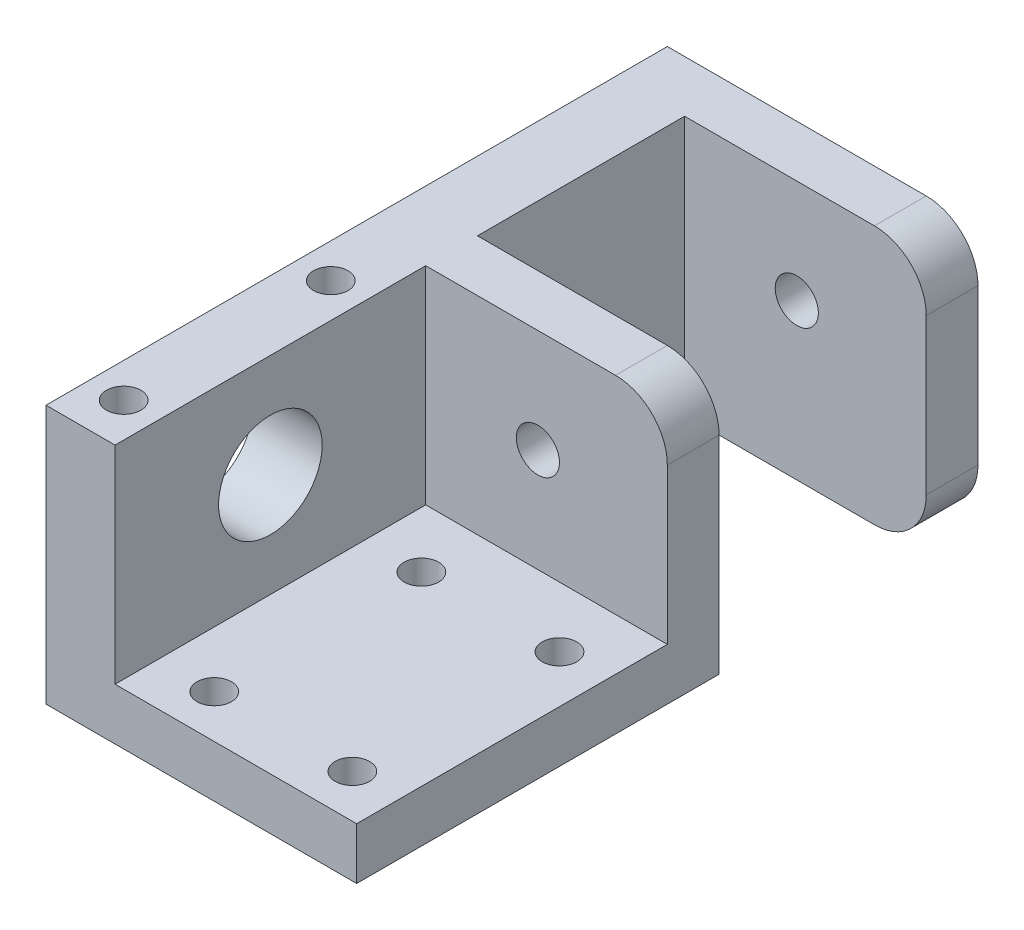
ISO-10303-21;
HEADER;
FILE_DESCRIPTION(('STEP AP214'),'2;1');
FILE_NAME('part.step','',(''),(''),'','','');
FILE_SCHEMA(('AUTOMOTIVE_DESIGN { 1 0 10303 214 1 1 1 1 }'));
ENDSEC;
DATA;
#1=APPLICATION_CONTEXT('core data for automotive mechanical design processes');
#2=APPLICATION_PROTOCOL_DEFINITION('international standard','automotive_design',2000,#1);
#3=PRODUCT_CONTEXT('',#1,'mechanical');
#4=PRODUCT('Part','Part','',(#3));
#5=PRODUCT_RELATED_PRODUCT_CATEGORY('part','',(#4));
#6=PRODUCT_DEFINITION_FORMATION('','',#4);
#7=PRODUCT_DEFINITION_CONTEXT('part definition',#1,'design');
#8=PRODUCT_DEFINITION('design','',#6,#7);
#9=PRODUCT_DEFINITION_SHAPE('','',#8);
#10=(LENGTH_UNIT() NAMED_UNIT(*) SI_UNIT(.MILLI.,.METRE.));
#11=(NAMED_UNIT(*) PLANE_ANGLE_UNIT() SI_UNIT($,.RADIAN.));
#12=(NAMED_UNIT(*) SI_UNIT($,.STERADIAN.) SOLID_ANGLE_UNIT());
#13=UNCERTAINTY_MEASURE_WITH_UNIT(LENGTH_MEASURE(1.E-05),#10,'distance_accuracy_value','');
#14=(GEOMETRIC_REPRESENTATION_CONTEXT(3) GLOBAL_UNCERTAINTY_ASSIGNED_CONTEXT((#13)) GLOBAL_UNIT_ASSIGNED_CONTEXT((#10,
#11,#12)) REPRESENTATION_CONTEXT('',''));
#15=CARTESIAN_POINT('',(0.,0.,0.));
#16=DIRECTION('',(0.,0.,1.));
#17=DIRECTION('',(1.,0.,0.));
#18=AXIS2_PLACEMENT_3D('',#15,#16,#17);
#19=CARTESIAN_POINT('',(18.,15.,0.));
#20=DIRECTION('',(0.,0.,1.));
#21=DIRECTION('',(1.,0.,0.));
#22=AXIS2_PLACEMENT_3D('',#19,#20,#21);
#23=PLANE('',#22);
#24=DIRECTION('',(0.,-1.,0.));
#25=VECTOR('',#24,1.);
#26=CARTESIAN_POINT('',(4.,15.,0.));
#27=LINE('',#26,#25);
#28=CARTESIAN_POINT('',(4.,15.,0.));
#29=VERTEX_POINT('',#28);
#30=CARTESIAN_POINT('',(4.,3.,0.));
#31=VERTEX_POINT('',#30);
#32=EDGE_CURVE('E151',#29,#31,#27,.T.);
#33=ORIENTED_EDGE('',*,*,#32,.T.);
#34=DIRECTION('',(1.,0.,0.));
#35=VECTOR('',#34,1.);
#36=CARTESIAN_POINT('',(0.,3.,0.));
#37=LINE('',#36,#35);
#38=CARTESIAN_POINT('',(18.,3.,0.));
#39=VERTEX_POINT('',#38);
#40=EDGE_CURVE('E173',#31,#39,#37,.T.);
#41=ORIENTED_EDGE('',*,*,#40,.T.);
#42=DIRECTION('',(0.,-1.,0.));
#43=VECTOR('',#42,1.);
#44=CARTESIAN_POINT('',(18.,15.,0.));
#45=LINE('',#44,#43);
#46=CARTESIAN_POINT('',(18.,12.,0.));
#47=VERTEX_POINT('',#46);
#48=EDGE_CURVE('E224',#47,#39,#45,.T.);
#49=ORIENTED_EDGE('',*,*,#48,.F.);
#50=CARTESIAN_POINT('',(15.,12.,0.));
#51=DIRECTION('',(0.,0.,1.));
#52=DIRECTION('',(1.,0.,0.));
#53=AXIS2_PLACEMENT_3D('',#50,#51,#52);
#54=CIRCLE('',#53,3.);
#55=CARTESIAN_POINT('',(15.,15.,0.));
#56=VERTEX_POINT('',#55);
#57=EDGE_CURVE('E244',#47,#56,#54,.T.);
#58=ORIENTED_EDGE('',*,*,#57,.T.);
#59=DIRECTION('',(-1.,0.,0.));
#60=VECTOR('',#59,1.);
#61=CARTESIAN_POINT('',(18.,15.,0.));
#62=LINE('',#61,#60);
#63=EDGE_CURVE('E54',#56,#29,#62,.T.);
#64=ORIENTED_EDGE('',*,*,#63,.T.);
#65=EDGE_LOOP('',(#33,#41,#49,#58,#64));
#66=FACE_BOUND('',#65,.T.);
#67=CARTESIAN_POINT('',(10.5,9.,0.));
#68=DIRECTION('',(0.,0.,1.));
#69=DIRECTION('',(1.,0.,0.));
#70=AXIS2_PLACEMENT_3D('',#67,#68,#69);
#71=CIRCLE('',#70,1.25);
#72=CARTESIAN_POINT('',(11.75,9.,0.));
#73=VERTEX_POINT('',#72);
#74=EDGE_CURVE('E185',#73,#73,#71,.F.);
#75=ORIENTED_EDGE('',*,*,#74,.T.);
#76=EDGE_LOOP('',(#75));
#77=FACE_BOUND('',#76,.T.);
#78=ADVANCED_FACE('F39',(#66,#77),#23,.T.);
#79=CARTESIAN_POINT('',(0.,15.,0.));
#80=DIRECTION('',(-1.,0.,0.));
#81=DIRECTION('',(0.,0.,1.));
#82=AXIS2_PLACEMENT_3D('',#79,#80,#81);
#83=PLANE('',#82);
#84=CARTESIAN_POINT('',(0.,9.,9.));
#85=DIRECTION('',(1.,0.,0.));
#86=DIRECTION('',(0.,0.,-1.));
#87=AXIS2_PLACEMENT_3D('',#84,#85,#86);
#88=CIRCLE('',#87,3.);
#89=CARTESIAN_POINT('',(0.,9.,6.));
#90=VERTEX_POINT('',#89);
#91=EDGE_CURVE('E162',#90,#90,#88,.T.);
#92=ORIENTED_EDGE('',*,*,#91,.T.);
#93=EDGE_LOOP('',(#92));
#94=FACE_BOUND('',#93,.T.);
#95=DIRECTION('',(0.,0.,-1.));
#96=VECTOR('',#95,1.);
#97=CARTESIAN_POINT('',(0.,0.,0.));
#98=LINE('',#97,#96);
#99=CARTESIAN_POINT('',(0.,0.,18.));
#100=VERTEX_POINT('',#99);
#101=CARTESIAN_POINT('',(0.,0.,-18.));
#102=VERTEX_POINT('',#101);
#103=EDGE_CURVE('E194',#100,#102,#98,.T.);
#104=ORIENTED_EDGE('',*,*,#103,.F.);
#105=DIRECTION('',(0.,1.,0.));
#106=VECTOR('',#105,1.);
#107=CARTESIAN_POINT('',(0.,0.,18.));
#108=LINE('',#107,#106);
#109=CARTESIAN_POINT('',(0.,15.,18.));
#110=VERTEX_POINT('',#109);
#111=EDGE_CURVE('E179',#100,#110,#108,.T.);
#112=ORIENTED_EDGE('',*,*,#111,.T.);
#113=DIRECTION('',(0.,0.,-1.));
#114=VECTOR('',#113,1.);
#115=CARTESIAN_POINT('',(0.,15.,0.));
#116=LINE('',#115,#114);
#117=CARTESIAN_POINT('',(0.,15.,-18.));
#118=VERTEX_POINT('',#117);
#119=EDGE_CURVE('E147',#110,#118,#116,.T.);
#120=ORIENTED_EDGE('',*,*,#119,.T.);
#121=DIRECTION('',(0.,-1.,0.));
#122=VECTOR('',#121,1.);
#123=CARTESIAN_POINT('',(0.,15.,-18.));
#124=LINE('',#123,#122);
#125=EDGE_CURVE('E209',#118,#102,#124,.T.);
#126=ORIENTED_EDGE('',*,*,#125,.T.);
#127=EDGE_LOOP('',(#104,#112,#120,#126));
#128=FACE_BOUND('',#127,.T.);
#129=ADVANCED_FACE('F294',(#94,#128),#83,.T.);
#130=CARTESIAN_POINT('',(18.,15.,-3.));
#131=DIRECTION('',(1.,0.,0.));
#132=DIRECTION('',(0.,0.,-1.));
#133=AXIS2_PLACEMENT_3D('',#130,#131,#132);
#134=PLANE('',#133);
#135=DIRECTION('',(0.,-1.,0.));
#136=VECTOR('',#135,1.);
#137=CARTESIAN_POINT('',(18.,15.,-3.));
#138=LINE('',#137,#136);
#139=CARTESIAN_POINT('',(18.,12.,-3.));
#140=VERTEX_POINT('',#139);
#141=CARTESIAN_POINT('',(18.,0.,-3.));
#142=VERTEX_POINT('',#141);
#143=EDGE_CURVE('E228',#140,#142,#138,.T.);
#144=ORIENTED_EDGE('',*,*,#143,.F.);
#145=DIRECTION('',(0.,0.,1.));
#146=VECTOR('',#145,1.);
#147=CARTESIAN_POINT('',(18.,12.,0.));
#148=LINE('',#147,#146);
#149=EDGE_CURVE('E227',#140,#47,#148,.T.);
#150=ORIENTED_EDGE('',*,*,#149,.T.);
#151=ORIENTED_EDGE('',*,*,#48,.T.);
#152=DIRECTION('',(0.,0.,-1.));
#153=VECTOR('',#152,1.);
#154=CARTESIAN_POINT('',(18.,3.,18.));
#155=LINE('',#154,#153);
#156=CARTESIAN_POINT('',(18.,3.,18.));
#157=VERTEX_POINT('',#156);
#158=EDGE_CURVE('E175',#157,#39,#155,.T.);
#159=ORIENTED_EDGE('',*,*,#158,.F.);
#160=DIRECTION('',(0.,1.,0.));
#161=VECTOR('',#160,1.);
#162=CARTESIAN_POINT('',(18.,0.,18.));
#163=LINE('',#162,#161);
#164=CARTESIAN_POINT('',(18.,0.,18.));
#165=VERTEX_POINT('',#164);
#166=EDGE_CURVE('E172',#165,#157,#163,.T.);
#167=ORIENTED_EDGE('',*,*,#166,.F.);
#168=DIRECTION('',(0.,0.,1.));
#169=VECTOR('',#168,1.);
#170=CARTESIAN_POINT('',(18.,0.,-3.));
#171=LINE('',#170,#169);
#172=EDGE_CURVE('E197',#142,#165,#171,.T.);
#173=ORIENTED_EDGE('',*,*,#172,.F.);
#174=EDGE_LOOP('',(#144,#150,#151,#159,#167,#173));
#175=FACE_BOUND('',#174,.T.);
#176=ADVANCED_FACE('F300',(#175),#134,.T.);
#177=CARTESIAN_POINT('',(4.,15.,-3.));
#178=DIRECTION('',(0.,0.,-1.));
#179=DIRECTION('',(-1.,0.,0.));
#180=AXIS2_PLACEMENT_3D('',#177,#178,#179);
#181=PLANE('',#180);
#182=CARTESIAN_POINT('',(10.5,9.,-3.));
#183=DIRECTION('',(0.,0.,-1.));
#184=DIRECTION('',(-1.,0.,0.));
#185=AXIS2_PLACEMENT_3D('',#182,#183,#184);
#186=CIRCLE('',#185,1.25);
#187=CARTESIAN_POINT('',(9.25,9.,-3.));
#188=VERTEX_POINT('',#187);
#189=EDGE_CURVE('E191',#188,#188,#186,.T.);
#190=ORIENTED_EDGE('',*,*,#189,.F.);
#191=EDGE_LOOP('',(#190));
#192=FACE_BOUND('',#191,.T.);
#193=DIRECTION('',(1.,0.,0.));
#194=VECTOR('',#193,1.);
#195=CARTESIAN_POINT('',(4.,15.,-3.));
#196=LINE('',#195,#194);
#197=CARTESIAN_POINT('',(4.,15.,-3.));
#198=VERTEX_POINT('',#197);
#199=CARTESIAN_POINT('',(15.,15.,-3.));
#200=VERTEX_POINT('',#199);
#201=EDGE_CURVE('E205',#198,#200,#196,.T.);
#202=ORIENTED_EDGE('',*,*,#201,.T.);
#203=CARTESIAN_POINT('',(15.,12.,-3.));
#204=DIRECTION('',(0.,0.,-1.));
#205=DIRECTION('',(-1.,0.,0.));
#206=AXIS2_PLACEMENT_3D('',#203,#204,#205);
#207=CIRCLE('',#206,3.);
#208=EDGE_CURVE('E250',#200,#140,#207,.T.);
#209=ORIENTED_EDGE('',*,*,#208,.T.);
#210=ORIENTED_EDGE('',*,*,#143,.T.);
#211=DIRECTION('',(1.,0.,0.));
#212=VECTOR('',#211,1.);
#213=CARTESIAN_POINT('',(4.,0.,-3.));
#214=LINE('',#213,#212);
#215=CARTESIAN_POINT('',(4.,0.,-3.));
#216=VERTEX_POINT('',#215);
#217=EDGE_CURVE('E220',#216,#142,#214,.T.);
#218=ORIENTED_EDGE('',*,*,#217,.F.);
#219=DIRECTION('',(0.,-1.,0.));
#220=VECTOR('',#219,1.);
#221=CARTESIAN_POINT('',(4.,15.,-3.));
#222=LINE('',#221,#220);
#223=EDGE_CURVE('E230',#198,#216,#222,.T.);
#224=ORIENTED_EDGE('',*,*,#223,.F.);
#225=EDGE_LOOP('',(#202,#209,#210,#218,#224));
#226=FACE_BOUND('',#225,.T.);
#227=ADVANCED_FACE('F330',(#192,#226),#181,.T.);
#228=CARTESIAN_POINT('',(4.,15.,-15.));
#229=DIRECTION('',(1.,0.,0.));
#230=DIRECTION('',(0.,0.,-1.));
#231=AXIS2_PLACEMENT_3D('',#228,#229,#230);
#232=PLANE('',#231);
#233=DIRECTION('',(0.,0.,1.));
#234=VECTOR('',#233,1.);
#235=CARTESIAN_POINT('',(4.,0.,-15.));
#236=LINE('',#235,#234);
#237=CARTESIAN_POINT('',(4.,0.,-15.));
#238=VERTEX_POINT('',#237);
#239=EDGE_CURVE('E217',#238,#216,#236,.T.);
#240=ORIENTED_EDGE('',*,*,#239,.F.);
#241=DIRECTION('',(0.,-1.,0.));
#242=VECTOR('',#241,1.);
#243=CARTESIAN_POINT('',(4.,15.,-15.));
#244=LINE('',#243,#242);
#245=CARTESIAN_POINT('',(4.,15.,-15.));
#246=VERTEX_POINT('',#245);
#247=EDGE_CURVE('E232',#246,#238,#244,.T.);
#248=ORIENTED_EDGE('',*,*,#247,.F.);
#249=DIRECTION('',(0.,0.,1.));
#250=VECTOR('',#249,1.);
#251=CARTESIAN_POINT('',(4.,15.,-15.));
#252=LINE('',#251,#250);
#253=EDGE_CURVE('E202',#246,#198,#252,.T.);
#254=ORIENTED_EDGE('',*,*,#253,.T.);
#255=ORIENTED_EDGE('',*,*,#223,.T.);
#256=EDGE_LOOP('',(#240,#248,#254,#255));
#257=FACE_BOUND('',#256,.T.);
#258=ADVANCED_FACE('F284',(#257),#232,.T.);
#259=CARTESIAN_POINT('',(18.,15.,-15.));
#260=DIRECTION('',(0.,0.,1.));
#261=DIRECTION('',(1.,0.,0.));
#262=AXIS2_PLACEMENT_3D('',#259,#260,#261);
#263=PLANE('',#262);
#264=CARTESIAN_POINT('',(10.5,9.,-15.));
#265=DIRECTION('',(0.,0.,1.));
#266=DIRECTION('',(1.,0.,0.));
#267=AXIS2_PLACEMENT_3D('',#264,#265,#266);
#268=CIRCLE('',#267,1.25);
#269=CARTESIAN_POINT('',(11.75,9.,-15.));
#270=VERTEX_POINT('',#269);
#271=EDGE_CURVE('E188',#270,#270,#268,.T.);
#272=ORIENTED_EDGE('',*,*,#271,.F.);
#273=EDGE_LOOP('',(#272));
#274=FACE_BOUND('',#273,.T.);
#275=DIRECTION('',(-1.,0.,0.));
#276=VECTOR('',#275,1.);
#277=CARTESIAN_POINT('',(18.,0.,-15.));
#278=LINE('',#277,#276);
#279=CARTESIAN_POINT('',(15.,0.,-15.));
#280=VERTEX_POINT('',#279);
#281=EDGE_CURVE('E215',#280,#238,#278,.T.);
#282=ORIENTED_EDGE('',*,*,#281,.F.);
#283=CARTESIAN_POINT('',(15.,3.,-15.));
#284=DIRECTION('',(0.,0.,1.));
#285=DIRECTION('',(1.,0.,0.));
#286=AXIS2_PLACEMENT_3D('',#283,#284,#285);
#287=CIRCLE('',#286,3.);
#288=CARTESIAN_POINT('',(18.,3.,-15.));
#289=VERTEX_POINT('',#288);
#290=EDGE_CURVE('E257',#280,#289,#287,.T.);
#291=ORIENTED_EDGE('',*,*,#290,.T.);
#292=DIRECTION('',(0.,-1.,0.));
#293=VECTOR('',#292,1.);
#294=CARTESIAN_POINT('',(18.,15.,-15.));
#295=LINE('',#294,#293);
#296=CARTESIAN_POINT('',(18.,12.,-15.));
#297=VERTEX_POINT('',#296);
#298=EDGE_CURVE('E235',#297,#289,#295,.T.);
#299=ORIENTED_EDGE('',*,*,#298,.F.);
#300=CARTESIAN_POINT('',(15.,12.,-15.));
#301=DIRECTION('',(0.,0.,1.));
#302=DIRECTION('',(1.,0.,0.));
#303=AXIS2_PLACEMENT_3D('',#300,#301,#302);
#304=CIRCLE('',#303,3.);
#305=CARTESIAN_POINT('',(15.,15.,-15.));
#306=VERTEX_POINT('',#305);
#307=EDGE_CURVE('E255',#297,#306,#304,.T.);
#308=ORIENTED_EDGE('',*,*,#307,.T.);
#309=DIRECTION('',(-1.,0.,0.));
#310=VECTOR('',#309,1.);
#311=CARTESIAN_POINT('',(18.,15.,-15.));
#312=LINE('',#311,#310);
#313=EDGE_CURVE('E200',#306,#246,#312,.T.);
#314=ORIENTED_EDGE('',*,*,#313,.T.);
#315=ORIENTED_EDGE('',*,*,#247,.T.);
#316=EDGE_LOOP('',(#282,#291,#299,#308,#314,#315));
#317=FACE_BOUND('',#316,.T.);
#318=ADVANCED_FACE('F278',(#274,#317),#263,.T.);
#319=CARTESIAN_POINT('',(18.,15.,-18.));
#320=DIRECTION('',(1.,0.,0.));
#321=DIRECTION('',(0.,0.,-1.));
#322=AXIS2_PLACEMENT_3D('',#319,#320,#321);
#323=PLANE('',#322);
#324=ORIENTED_EDGE('',*,*,#298,.T.);
#325=DIRECTION('',(0.,0.,1.));
#326=VECTOR('',#325,1.);
#327=CARTESIAN_POINT('',(18.,3.,-18.));
#328=LINE('',#327,#326);
#329=CARTESIAN_POINT('',(18.,3.,-18.));
#330=VERTEX_POINT('',#329);
#331=EDGE_CURVE('E262',#289,#330,#328,.F.);
#332=ORIENTED_EDGE('',*,*,#331,.T.);
#333=DIRECTION('',(0.,-1.,0.));
#334=VECTOR('',#333,1.);
#335=CARTESIAN_POINT('',(18.,15.,-18.));
#336=LINE('',#335,#334);
#337=CARTESIAN_POINT('',(18.,12.,-18.));
#338=VERTEX_POINT('',#337);
#339=EDGE_CURVE('E238',#338,#330,#336,.T.);
#340=ORIENTED_EDGE('',*,*,#339,.F.);
#341=DIRECTION('',(0.,0.,1.));
#342=VECTOR('',#341,1.);
#343=CARTESIAN_POINT('',(18.,12.,-15.));
#344=LINE('',#343,#342);
#345=EDGE_CURVE('E259',#338,#297,#344,.T.);
#346=ORIENTED_EDGE('',*,*,#345,.T.);
#347=EDGE_LOOP('',(#324,#332,#340,#346));
#348=FACE_BOUND('',#347,.T.);
#349=ADVANCED_FACE('F272',(#348),#323,.T.);
#350=CARTESIAN_POINT('',(0.,15.,-18.));
#351=DIRECTION('',(0.,0.,-1.));
#352=DIRECTION('',(-1.,0.,0.));
#353=AXIS2_PLACEMENT_3D('',#350,#351,#352);
#354=PLANE('',#353);
#355=CARTESIAN_POINT('',(10.5,9.,-18.));
#356=DIRECTION('',(0.,0.,-1.));
#357=DIRECTION('',(-1.,0.,0.));
#358=AXIS2_PLACEMENT_3D('',#355,#356,#357);
#359=CIRCLE('',#358,1.25);
#360=CARTESIAN_POINT('',(9.25,9.,-18.));
#361=VERTEX_POINT('',#360);
#362=EDGE_CURVE('E181',#361,#361,#359,.T.);
#363=ORIENTED_EDGE('',*,*,#362,.F.);
#364=EDGE_LOOP('',(#363));
#365=FACE_BOUND('',#364,.T.);
#366=ORIENTED_EDGE('',*,*,#339,.T.);
#367=CARTESIAN_POINT('',(15.,3.,-18.));
#368=DIRECTION('',(0.,0.,-1.));
#369=DIRECTION('',(-1.,0.,0.));
#370=AXIS2_PLACEMENT_3D('',#367,#368,#369);
#371=CIRCLE('',#370,3.);
#372=CARTESIAN_POINT('',(15.,0.,-18.));
#373=VERTEX_POINT('',#372);
#374=EDGE_CURVE('E11',#330,#373,#371,.T.);
#375=ORIENTED_EDGE('',*,*,#374,.T.);
#376=DIRECTION('',(1.,0.,0.));
#377=VECTOR('',#376,1.);
#378=CARTESIAN_POINT('',(0.,0.,-18.));
#379=LINE('',#378,#377);
#380=EDGE_CURVE('E212',#102,#373,#379,.T.);
#381=ORIENTED_EDGE('',*,*,#380,.F.);
#382=ORIENTED_EDGE('',*,*,#125,.F.);
#383=DIRECTION('',(1.,0.,0.));
#384=VECTOR('',#383,1.);
#385=CARTESIAN_POINT('',(0.,15.,-18.));
#386=LINE('',#385,#384);
#387=CARTESIAN_POINT('',(15.,15.,-18.));
#388=VERTEX_POINT('',#387);
#389=EDGE_CURVE('E196',#118,#388,#386,.T.);
#390=ORIENTED_EDGE('',*,*,#389,.T.);
#391=CARTESIAN_POINT('',(15.,12.,-18.));
#392=DIRECTION('',(0.,0.,-1.));
#393=DIRECTION('',(-1.,0.,0.));
#394=AXIS2_PLACEMENT_3D('',#391,#392,#393);
#395=CIRCLE('',#394,3.);
#396=EDGE_CURVE('E47',#388,#338,#395,.T.);
#397=ORIENTED_EDGE('',*,*,#396,.T.);
#398=EDGE_LOOP('',(#366,#375,#381,#382,#390,#397));
#399=FACE_BOUND('',#398,.T.);
#400=ADVANCED_FACE('F266',(#365,#399),#354,.T.);
#401=CARTESIAN_POINT('',(0.,15.,0.));
#402=DIRECTION('',(0.,-1.,0.));
#403=DIRECTION('',(0.,0.,-1.));
#404=AXIS2_PLACEMENT_3D('',#401,#402,#403);
#405=PLANE('',#404);
#406=CARTESIAN_POINT('',(2.,15.,15.5));
#407=DIRECTION('',(0.,1.,0.));
#408=DIRECTION('',(0.,0.,1.));
#409=AXIS2_PLACEMENT_3D('',#406,#407,#408);
#410=CIRCLE('',#409,1.);
#411=CARTESIAN_POINT('',(2.,15.,16.5));
#412=VERTEX_POINT('',#411);
#413=EDGE_CURVE('E552',#412,#412,#410,.T.);
#414=ORIENTED_EDGE('',*,*,#413,.F.);
#415=EDGE_LOOP('',(#414));
#416=FACE_BOUND('',#415,.T.);
#417=CARTESIAN_POINT('',(2.,15.,3.5));
#418=DIRECTION('',(0.,1.,0.));
#419=DIRECTION('',(0.,0.,1.));
#420=AXIS2_PLACEMENT_3D('',#417,#418,#419);
#421=CIRCLE('',#420,1.);
#422=CARTESIAN_POINT('',(2.,15.,4.5));
#423=VERTEX_POINT('',#422);
#424=EDGE_CURVE('E558',#423,#423,#421,.T.);
#425=ORIENTED_EDGE('',*,*,#424,.F.);
#426=EDGE_LOOP('',(#425));
#427=FACE_BOUND('',#426,.T.);
#428=ORIENTED_EDGE('',*,*,#63,.F.);
#429=DIRECTION('',(0.,0.,1.));
#430=VECTOR('',#429,1.);
#431=CARTESIAN_POINT('',(15.,15.,-3.));
#432=LINE('',#431,#430);
#433=EDGE_CURVE('E248',#56,#200,#432,.F.);
#434=ORIENTED_EDGE('',*,*,#433,.T.);
#435=ORIENTED_EDGE('',*,*,#201,.F.);
#436=ORIENTED_EDGE('',*,*,#253,.F.);
#437=ORIENTED_EDGE('',*,*,#313,.F.);
#438=DIRECTION('',(0.,0.,1.));
#439=VECTOR('',#438,1.);
#440=CARTESIAN_POINT('',(15.,15.,-18.));
#441=LINE('',#440,#439);
#442=EDGE_CURVE('E246',#306,#388,#441,.F.);
#443=ORIENTED_EDGE('',*,*,#442,.T.);
#444=ORIENTED_EDGE('',*,*,#389,.F.);
#445=ORIENTED_EDGE('',*,*,#119,.F.);
#446=DIRECTION('',(1.,0.,0.));
#447=VECTOR('',#446,1.);
#448=CARTESIAN_POINT('',(0.,15.,18.));
#449=LINE('',#448,#447);
#450=CARTESIAN_POINT('',(4.,15.,18.));
#451=VERTEX_POINT('',#450);
#452=EDGE_CURVE('E140',#110,#451,#449,.T.);
#453=ORIENTED_EDGE('',*,*,#452,.T.);
#454=DIRECTION('',(0.,0.,1.));
#455=VECTOR('',#454,1.);
#456=CARTESIAN_POINT('',(4.,15.,0.));
#457=LINE('',#456,#455);
#458=EDGE_CURVE('E144',#29,#451,#457,.T.);
#459=ORIENTED_EDGE('',*,*,#458,.F.);
#460=EDGE_LOOP('',(#428,#434,#435,#436,#437,#443,#444,#445,#453,#459));
#461=FACE_BOUND('',#460,.T.);
#462=ADVANCED_FACE('F142',(#416,#427,#461),#405,.F.);
#463=CARTESIAN_POINT('',(0.,0.,0.));
#464=DIRECTION('',(0.,-1.,0.));
#465=DIRECTION('',(0.,0.,-1.));
#466=AXIS2_PLACEMENT_3D('',#463,#464,#465);
#467=PLANE('',#466);
#468=CARTESIAN_POINT('',(15.249999999999,0.,15.4999999999987));
#469=DIRECTION('',(0.,1.,0.));
#470=DIRECTION('',(0.,0.,1.));
#471=AXIS2_PLACEMENT_3D('',#468,#469,#470);
#472=CIRCLE('',#471,0.999999999999673);
#473=CARTESIAN_POINT('',(15.249999999999,0.,16.4999999999983));
#474=VERTEX_POINT('',#473);
#475=EDGE_CURVE('E573',#474,#474,#472,.T.);
#476=ORIENTED_EDGE('',*,*,#475,.T.);
#477=EDGE_LOOP('',(#476));
#478=FACE_BOUND('',#477,.T.);
#479=CARTESIAN_POINT('',(7.24999999999916,0.,3.49999999999857));
#480=DIRECTION('',(0.,1.,0.));
#481=DIRECTION('',(0.,0.,1.));
#482=AXIS2_PLACEMENT_3D('',#479,#480,#481);
#483=CIRCLE('',#482,0.999999999999672);
#484=CARTESIAN_POINT('',(7.24999999999916,0.,4.49999999999824));
#485=VERTEX_POINT('',#484);
#486=EDGE_CURVE('E567',#485,#485,#483,.T.);
#487=ORIENTED_EDGE('',*,*,#486,.T.);
#488=EDGE_LOOP('',(#487));
#489=FACE_BOUND('',#488,.T.);
#490=CARTESIAN_POINT('',(15.2499999999992,0.,3.49999999999865));
#491=DIRECTION('',(0.,1.,0.));
#492=DIRECTION('',(0.,0.,1.));
#493=AXIS2_PLACEMENT_3D('',#490,#491,#492);
#494=CIRCLE('',#493,0.999999999999673);
#495=CARTESIAN_POINT('',(15.2499999999992,0.,4.49999999999833));
#496=VERTEX_POINT('',#495);
#497=EDGE_CURVE('E551',#496,#496,#494,.T.);
#498=ORIENTED_EDGE('',*,*,#497,.T.);
#499=EDGE_LOOP('',(#498));
#500=FACE_BOUND('',#499,.T.);
#501=CARTESIAN_POINT('',(7.24999999999903,0.,15.4999999999986));
#502=DIRECTION('',(0.,1.,0.));
#503=DIRECTION('',(0.,0.,1.));
#504=AXIS2_PLACEMENT_3D('',#501,#502,#503);
#505=CIRCLE('',#504,0.999999999999673);
#506=CARTESIAN_POINT('',(7.24999999999903,0.,16.4999999999982));
#507=VERTEX_POINT('',#506);
#508=EDGE_CURVE('E581',#507,#507,#505,.T.);
#509=ORIENTED_EDGE('',*,*,#508,.T.);
#510=EDGE_LOOP('',(#509));
#511=FACE_BOUND('',#510,.T.);
#512=ORIENTED_EDGE('',*,*,#380,.T.);
#513=DIRECTION('',(0.,0.,1.));
#514=VECTOR('',#513,1.);
#515=CARTESIAN_POINT('',(15.,0.,0.));
#516=LINE('',#515,#514);
#517=EDGE_CURVE('E252',#373,#280,#516,.T.);
#518=ORIENTED_EDGE('',*,*,#517,.T.);
#519=ORIENTED_EDGE('',*,*,#281,.T.);
#520=ORIENTED_EDGE('',*,*,#239,.T.);
#521=ORIENTED_EDGE('',*,*,#217,.T.);
#522=ORIENTED_EDGE('',*,*,#172,.T.);
#523=DIRECTION('',(1.,0.,0.));
#524=VECTOR('',#523,1.);
#525=CARTESIAN_POINT('',(0.,0.,18.));
#526=LINE('',#525,#524);
#527=EDGE_CURVE('E169',#100,#165,#526,.T.);
#528=ORIENTED_EDGE('',*,*,#527,.F.);
#529=ORIENTED_EDGE('',*,*,#103,.T.);
#530=EDGE_LOOP('',(#512,#518,#519,#520,#521,#522,#528,#529));
#531=FACE_BOUND('',#530,.T.);
#532=ADVANCED_FACE('F287',(#478,#489,#500,#511,#531),#467,.T.);
#533=CARTESIAN_POINT('',(15.,12.,-3.));
#534=DIRECTION('',(0.,0.,-1.));
#535=DIRECTION('',(-1.,0.,0.));
#536=AXIS2_PLACEMENT_3D('',#533,#534,#535);
#537=CYLINDRICAL_SURFACE('',#536,3.);
#538=ORIENTED_EDGE('',*,*,#208,.F.);
#539=ORIENTED_EDGE('',*,*,#433,.F.);
#540=ORIENTED_EDGE('',*,*,#57,.F.);
#541=ORIENTED_EDGE('',*,*,#149,.F.);
#542=EDGE_LOOP('',(#538,#539,#540,#541));
#543=FACE_BOUND('',#542,.T.);
#544=ADVANCED_FACE('F325',(#543),#537,.T.);
#545=CARTESIAN_POINT('',(15.,3.,0.));
#546=DIRECTION('',(0.,0.,1.));
#547=DIRECTION('',(1.,0.,0.));
#548=AXIS2_PLACEMENT_3D('',#545,#546,#547);
#549=CYLINDRICAL_SURFACE('',#548,3.);
#550=ORIENTED_EDGE('',*,*,#374,.F.);
#551=ORIENTED_EDGE('',*,*,#331,.F.);
#552=ORIENTED_EDGE('',*,*,#290,.F.);
#553=ORIENTED_EDGE('',*,*,#517,.F.);
#554=EDGE_LOOP('',(#550,#551,#552,#553));
#555=FACE_BOUND('',#554,.T.);
#556=ADVANCED_FACE('F291',(#555),#549,.T.);
#557=CARTESIAN_POINT('',(15.,12.,-18.));
#558=DIRECTION('',(0.,0.,-1.));
#559=DIRECTION('',(-1.,0.,0.));
#560=AXIS2_PLACEMENT_3D('',#557,#558,#559);
#561=CYLINDRICAL_SURFACE('',#560,3.);
#562=ORIENTED_EDGE('',*,*,#396,.F.);
#563=ORIENTED_EDGE('',*,*,#442,.F.);
#564=ORIENTED_EDGE('',*,*,#307,.F.);
#565=ORIENTED_EDGE('',*,*,#345,.F.);
#566=EDGE_LOOP('',(#562,#563,#564,#565));
#567=FACE_BOUND('',#566,.T.);
#568=ADVANCED_FACE('F41',(#567),#561,.T.);
#569=CARTESIAN_POINT('',(10.5,9.,3.53553390593274));
#570=DIRECTION('',(0.,0.,-1.));
#571=DIRECTION('',(-1.,0.,0.));
#572=AXIS2_PLACEMENT_3D('',#569,#570,#571);
#573=CYLINDRICAL_SURFACE('',#572,1.25);
#574=ORIENTED_EDGE('',*,*,#271,.T.);
#575=EDGE_LOOP('',(#574));
#576=FACE_BOUND('',#575,.T.);
#577=ORIENTED_EDGE('',*,*,#362,.T.);
#578=EDGE_LOOP('',(#577));
#579=FACE_BOUND('',#578,.T.);
#580=ADVANCED_FACE('F310',(#576,#579),#573,.F.);
#581=ORIENTED_EDGE('',*,*,#189,.T.);
#582=EDGE_LOOP('',(#581));
#583=FACE_BOUND('',#582,.T.);
#584=ORIENTED_EDGE('',*,*,#74,.F.);
#585=EDGE_LOOP('',(#584));
#586=FACE_BOUND('',#585,.T.);
#587=ADVANCED_FACE('F308',(#583,#586),#573,.F.);
#588=CARTESIAN_POINT('',(0.,0.,18.));
#589=DIRECTION('',(0.,0.,1.));
#590=DIRECTION('',(1.,0.,0.));
#591=AXIS2_PLACEMENT_3D('',#588,#589,#590);
#592=PLANE('',#591);
#593=DIRECTION('',(1.,0.,0.));
#594=VECTOR('',#593,1.);
#595=CARTESIAN_POINT('',(0.,3.,18.));
#596=LINE('',#595,#594);
#597=CARTESIAN_POINT('',(4.,3.,18.));
#598=VERTEX_POINT('',#597);
#599=EDGE_CURVE('E157',#598,#157,#596,.T.);
#600=ORIENTED_EDGE('',*,*,#599,.F.);
#601=DIRECTION('',(0.,-1.,0.));
#602=VECTOR('',#601,1.);
#603=CARTESIAN_POINT('',(4.,15.,18.));
#604=LINE('',#603,#602);
#605=EDGE_CURVE('E154',#451,#598,#604,.T.);
#606=ORIENTED_EDGE('',*,*,#605,.F.);
#607=ORIENTED_EDGE('',*,*,#452,.F.);
#608=ORIENTED_EDGE('',*,*,#111,.F.);
#609=ORIENTED_EDGE('',*,*,#527,.T.);
#610=ORIENTED_EDGE('',*,*,#166,.T.);
#611=EDGE_LOOP('',(#600,#606,#607,#608,#609,#610));
#612=FACE_BOUND('',#611,.T.);
#613=ADVANCED_FACE('F155',(#612),#592,.T.);
#614=CARTESIAN_POINT('',(0.,3.,0.));
#615=DIRECTION('',(0.,1.,0.));
#616=DIRECTION('',(0.,0.,1.));
#617=AXIS2_PLACEMENT_3D('',#614,#615,#616);
#618=PLANE('',#617);
#619=CARTESIAN_POINT('',(15.249999999999,3.,15.4999999999987));
#620=DIRECTION('',(0.,1.,0.));
#621=DIRECTION('',(0.,0.,1.));
#622=AXIS2_PLACEMENT_3D('',#619,#620,#621);
#623=CIRCLE('',#622,0.999999999999673);
#624=CARTESIAN_POINT('',(15.249999999999,3.,16.4999999999983));
#625=VERTEX_POINT('',#624);
#626=EDGE_CURVE('E569',#625,#625,#623,.T.);
#627=ORIENTED_EDGE('',*,*,#626,.F.);
#628=EDGE_LOOP('',(#627));
#629=FACE_BOUND('',#628,.T.);
#630=CARTESIAN_POINT('',(7.24999999999916,3.,3.49999999999857));
#631=DIRECTION('',(0.,1.,0.));
#632=DIRECTION('',(0.,0.,1.));
#633=AXIS2_PLACEMENT_3D('',#630,#631,#632);
#634=CIRCLE('',#633,0.999999999999672);
#635=CARTESIAN_POINT('',(7.24999999999916,3.,4.49999999999824));
#636=VERTEX_POINT('',#635);
#637=EDGE_CURVE('E576',#636,#636,#634,.T.);
#638=ORIENTED_EDGE('',*,*,#637,.F.);
#639=EDGE_LOOP('',(#638));
#640=FACE_BOUND('',#639,.T.);
#641=CARTESIAN_POINT('',(15.2499999999992,3.,3.49999999999865));
#642=DIRECTION('',(0.,1.,0.));
#643=DIRECTION('',(0.,0.,1.));
#644=AXIS2_PLACEMENT_3D('',#641,#642,#643);
#645=CIRCLE('',#644,0.999999999999673);
#646=CARTESIAN_POINT('',(15.2499999999992,3.,4.49999999999833));
#647=VERTEX_POINT('',#646);
#648=EDGE_CURVE('E555',#647,#647,#645,.T.);
#649=ORIENTED_EDGE('',*,*,#648,.F.);
#650=EDGE_LOOP('',(#649));
#651=FACE_BOUND('',#650,.T.);
#652=CARTESIAN_POINT('',(7.24999999999903,3.,15.4999999999986));
#653=DIRECTION('',(0.,1.,0.));
#654=DIRECTION('',(0.,0.,1.));
#655=AXIS2_PLACEMENT_3D('',#652,#653,#654);
#656=CIRCLE('',#655,0.999999999999673);
#657=CARTESIAN_POINT('',(7.24999999999903,3.,16.4999999999982));
#658=VERTEX_POINT('',#657);
#659=EDGE_CURVE('E572',#658,#658,#656,.T.);
#660=ORIENTED_EDGE('',*,*,#659,.F.);
#661=EDGE_LOOP('',(#660));
#662=FACE_BOUND('',#661,.T.);
#663=DIRECTION('',(0.,0.,1.));
#664=VECTOR('',#663,1.);
#665=CARTESIAN_POINT('',(4.,3.,0.));
#666=LINE('',#665,#664);
#667=EDGE_CURVE('E62',#31,#598,#666,.T.);
#668=ORIENTED_EDGE('',*,*,#667,.T.);
#669=ORIENTED_EDGE('',*,*,#599,.T.);
#670=ORIENTED_EDGE('',*,*,#158,.T.);
#671=ORIENTED_EDGE('',*,*,#40,.F.);
#672=EDGE_LOOP('',(#668,#669,#670,#671));
#673=FACE_BOUND('',#672,.T.);
#674=ADVANCED_FACE('F302',(#629,#640,#651,#662,#673),#618,.T.);
#675=CARTESIAN_POINT('',(4.,15.,0.));
#676=DIRECTION('',(1.,0.,0.));
#677=DIRECTION('',(0.,0.,-1.));
#678=AXIS2_PLACEMENT_3D('',#675,#676,#677);
#679=PLANE('',#678);
#680=CARTESIAN_POINT('',(4.,9.,9.));
#681=DIRECTION('',(1.,0.,0.));
#682=DIRECTION('',(0.,0.,-1.));
#683=AXIS2_PLACEMENT_3D('',#680,#681,#682);
#684=CIRCLE('',#683,3.);
#685=CARTESIAN_POINT('',(4.,9.,6.));
#686=VERTEX_POINT('',#685);
#687=EDGE_CURVE('E165',#686,#686,#684,.T.);
#688=ORIENTED_EDGE('',*,*,#687,.F.);
#689=EDGE_LOOP('',(#688));
#690=FACE_BOUND('',#689,.T.);
#691=ORIENTED_EDGE('',*,*,#667,.F.);
#692=ORIENTED_EDGE('',*,*,#32,.F.);
#693=ORIENTED_EDGE('',*,*,#458,.T.);
#694=ORIENTED_EDGE('',*,*,#605,.T.);
#695=EDGE_LOOP('',(#691,#692,#693,#694));
#696=FACE_BOUND('',#695,.T.);
#697=ADVANCED_FACE('F160',(#690,#696),#679,.T.);
#698=CARTESIAN_POINT('',(0.,9.,9.));
#699=DIRECTION('',(1.,0.,0.));
#700=DIRECTION('',(0.,0.,-1.));
#701=AXIS2_PLACEMENT_3D('',#698,#699,#700);
#702=CYLINDRICAL_SURFACE('',#701,3.);
#703=ORIENTED_EDGE('',*,*,#91,.F.);
#704=EDGE_LOOP('',(#703));
#705=FACE_BOUND('',#704,.T.);
#706=ORIENTED_EDGE('',*,*,#687,.T.);
#707=EDGE_LOOP('',(#706));
#708=FACE_BOUND('',#707,.T.);
#709=ADVANCED_FACE('F411',(#705,#708),#702,.F.);
#710=CARTESIAN_POINT('',(7.24999999999903,0.,15.4999999999986));
#711=DIRECTION('',(0.,1.,0.));
#712=DIRECTION('',(0.,0.,1.));
#713=AXIS2_PLACEMENT_3D('',#710,#711,#712);
#714=CYLINDRICAL_SURFACE('',#713,0.999999999999673);
#715=ORIENTED_EDGE('',*,*,#508,.F.);
#716=EDGE_LOOP('',(#715));
#717=FACE_BOUND('',#716,.T.);
#718=ORIENTED_EDGE('',*,*,#659,.T.);
#719=EDGE_LOOP('',(#718));
#720=FACE_BOUND('',#719,.T.);
#721=ADVANCED_FACE('F422',(#717,#720),#714,.F.);
#722=CARTESIAN_POINT('',(15.2499999999992,0.,3.49999999999865));
#723=DIRECTION('',(0.,1.,0.));
#724=DIRECTION('',(0.,0.,1.));
#725=AXIS2_PLACEMENT_3D('',#722,#723,#724);
#726=CYLINDRICAL_SURFACE('',#725,0.999999999999673);
#727=ORIENTED_EDGE('',*,*,#497,.F.);
#728=EDGE_LOOP('',(#727));
#729=FACE_BOUND('',#728,.T.);
#730=ORIENTED_EDGE('',*,*,#648,.T.);
#731=EDGE_LOOP('',(#730));
#732=FACE_BOUND('',#731,.T.);
#733=ADVANCED_FACE('F446',(#729,#732),#726,.F.);
#734=CARTESIAN_POINT('',(7.24999999999916,0.,3.49999999999857));
#735=DIRECTION('',(0.,1.,0.));
#736=DIRECTION('',(0.,0.,1.));
#737=AXIS2_PLACEMENT_3D('',#734,#735,#736);
#738=CYLINDRICAL_SURFACE('',#737,0.999999999999672);
#739=ORIENTED_EDGE('',*,*,#486,.F.);
#740=EDGE_LOOP('',(#739));
#741=FACE_BOUND('',#740,.T.);
#742=ORIENTED_EDGE('',*,*,#637,.T.);
#743=EDGE_LOOP('',(#742));
#744=FACE_BOUND('',#743,.T.);
#745=ADVANCED_FACE('F457',(#741,#744),#738,.F.);
#746=CARTESIAN_POINT('',(15.249999999999,0.,15.4999999999987));
#747=DIRECTION('',(0.,1.,0.));
#748=DIRECTION('',(0.,0.,1.));
#749=AXIS2_PLACEMENT_3D('',#746,#747,#748);
#750=CYLINDRICAL_SURFACE('',#749,0.999999999999673);
#751=ORIENTED_EDGE('',*,*,#475,.F.);
#752=EDGE_LOOP('',(#751));
#753=FACE_BOUND('',#752,.T.);
#754=ORIENTED_EDGE('',*,*,#626,.T.);
#755=EDGE_LOOP('',(#754));
#756=FACE_BOUND('',#755,.T.);
#757=ADVANCED_FACE('F468',(#753,#756),#750,.F.);
#758=CARTESIAN_POINT('',(2.,10.,3.5));
#759=DIRECTION('',(0.,1.,0.));
#760=DIRECTION('',(0.,0.,1.));
#761=AXIS2_PLACEMENT_3D('',#758,#759,#760);
#762=CYLINDRICAL_SURFACE('',#761,1.);
#763=CARTESIAN_POINT('',(2.,10.,3.5));
#764=DIRECTION('',(0.,1.,0.));
#765=DIRECTION('',(0.,0.,1.));
#766=AXIS2_PLACEMENT_3D('',#763,#764,#765);
#767=CIRCLE('',#766,1.);
#768=CARTESIAN_POINT('',(2.,10.,4.5));
#769=VERTEX_POINT('',#768);
#770=EDGE_CURVE('E563',#769,#769,#767,.T.);
#771=ORIENTED_EDGE('',*,*,#770,.F.);
#772=EDGE_LOOP('',(#771));
#773=FACE_BOUND('',#772,.T.);
#774=ORIENTED_EDGE('',*,*,#424,.T.);
#775=EDGE_LOOP('',(#774));
#776=FACE_BOUND('',#775,.T.);
#777=ADVANCED_FACE('F479',(#773,#776),#762,.F.);
#778=CARTESIAN_POINT('',(2.,10.,3.5));
#779=DIRECTION('',(0.,1.,0.));
#780=DIRECTION('',(0.,0.,1.));
#781=AXIS2_PLACEMENT_3D('',#778,#779,#780);
#782=PLANE('',#781);
#783=ORIENTED_EDGE('',*,*,#770,.T.);
#784=EDGE_LOOP('',(#783));
#785=FACE_BOUND('',#784,.T.);
#786=ADVANCED_FACE('F496',(#785),#782,.T.);
#787=CARTESIAN_POINT('',(2.,10.,15.5));
#788=DIRECTION('',(0.,1.,0.));
#789=DIRECTION('',(0.,0.,1.));
#790=AXIS2_PLACEMENT_3D('',#787,#788,#789);
#791=CYLINDRICAL_SURFACE('',#790,1.);
#792=CARTESIAN_POINT('',(2.,10.,15.5));
#793=DIRECTION('',(0.,1.,0.));
#794=DIRECTION('',(0.,0.,1.));
#795=AXIS2_PLACEMENT_3D('',#792,#793,#794);
#796=CIRCLE('',#795,1.);
#797=CARTESIAN_POINT('',(2.,10.,16.5));
#798=VERTEX_POINT('',#797);
#799=EDGE_CURVE('E550',#798,#798,#796,.T.);
#800=ORIENTED_EDGE('',*,*,#799,.F.);
#801=EDGE_LOOP('',(#800));
#802=FACE_BOUND('',#801,.T.);
#803=ORIENTED_EDGE('',*,*,#413,.T.);
#804=EDGE_LOOP('',(#803));
#805=FACE_BOUND('',#804,.T.);
#806=ADVANCED_FACE('F507',(#802,#805),#791,.F.);
#807=CARTESIAN_POINT('',(2.,10.,15.5));
#808=DIRECTION('',(0.,1.,0.));
#809=DIRECTION('',(0.,0.,1.));
#810=AXIS2_PLACEMENT_3D('',#807,#808,#809);
#811=PLANE('',#810);
#812=ORIENTED_EDGE('',*,*,#799,.T.);
#813=EDGE_LOOP('',(#812));
#814=FACE_BOUND('',#813,.T.);
#815=ADVANCED_FACE('F518',(#814),#811,.T.);
#816=CLOSED_SHELL('',(#78,#129,#176,#227,#258,#318,#349,#400,#462,#532,#544,#556,#568,#580,#587,
#613,#674,#697,#709,#721,#733,#745,#757,#777,#786,#806,#815));
#817=MANIFOLD_SOLID_BREP('B2',#816);
#818=ADVANCED_BREP_SHAPE_REPRESENTATION('',(#18,#817),#14);
#819=SHAPE_DEFINITION_REPRESENTATION(#9,#818);
ENDSEC;
END-ISO-10303-21;
